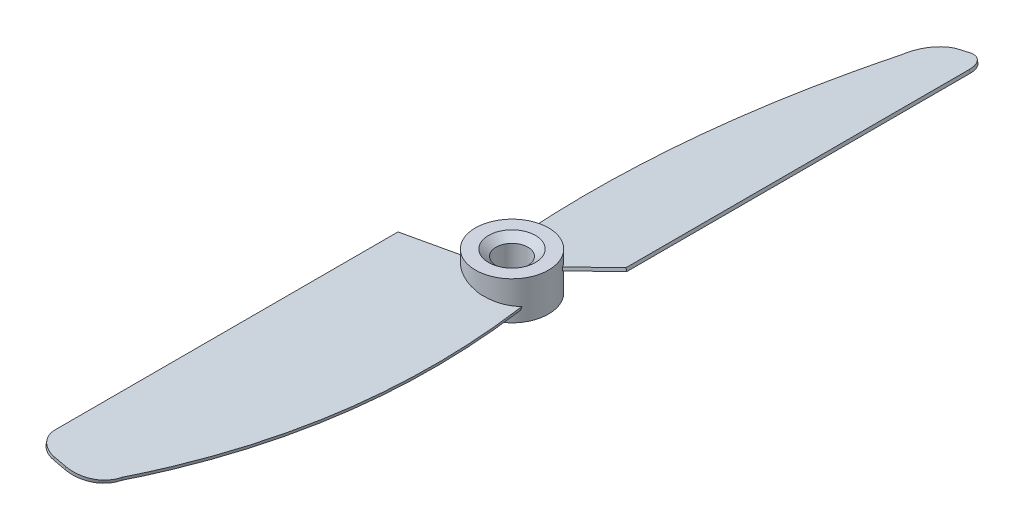
ISO-10303-21;
HEADER;
FILE_DESCRIPTION(('STEP AP214'),'2;1');
FILE_NAME('part.step','',(''),(''),'','','');
FILE_SCHEMA(('AUTOMOTIVE_DESIGN { 1 0 10303 214 1 1 1 1 }'));
ENDSEC;
DATA;
#1=APPLICATION_CONTEXT('core data for automotive mechanical design processes');
#2=APPLICATION_PROTOCOL_DEFINITION('international standard','automotive_design',2000,#1);
#3=PRODUCT_CONTEXT('',#1,'mechanical');
#4=PRODUCT('Part','Part','',(#3));
#5=PRODUCT_RELATED_PRODUCT_CATEGORY('part','',(#4));
#6=PRODUCT_DEFINITION_FORMATION('','',#4);
#7=PRODUCT_DEFINITION_CONTEXT('part definition',#1,'design');
#8=PRODUCT_DEFINITION('design','',#6,#7);
#9=PRODUCT_DEFINITION_SHAPE('','',#8);
#10=(LENGTH_UNIT() NAMED_UNIT(*) SI_UNIT(.MILLI.,.METRE.));
#11=(NAMED_UNIT(*) PLANE_ANGLE_UNIT() SI_UNIT($,.RADIAN.));
#12=(NAMED_UNIT(*) SI_UNIT($,.STERADIAN.) SOLID_ANGLE_UNIT());
#13=UNCERTAINTY_MEASURE_WITH_UNIT(LENGTH_MEASURE(1.E-05),#10,'distance_accuracy_value','');
#14=(GEOMETRIC_REPRESENTATION_CONTEXT(3) GLOBAL_UNCERTAINTY_ASSIGNED_CONTEXT((#13)) GLOBAL_UNIT_ASSIGNED_CONTEXT((#10,
#11,#12)) REPRESENTATION_CONTEXT('',''));
#15=CARTESIAN_POINT('',(0.,0.,0.));
#16=DIRECTION('',(0.,0.,1.));
#17=DIRECTION('',(1.,0.,0.));
#18=AXIS2_PLACEMENT_3D('',#15,#16,#17);
#19=CARTESIAN_POINT('',(0.,3.,0.));
#20=DIRECTION('',(0.,-1.,0.));
#21=DIRECTION('',(0.,0.,-1.));
#22=AXIS2_PLACEMENT_3D('',#19,#20,#21);
#23=CYLINDRICAL_SURFACE('',#22,5.75);
#24=CARTESIAN_POINT('',(-4.67726336570313,-1.3364073596061,-3.34450406007399));
#25=CARTESIAN_POINT('',(-4.69341324684552,-1.25444783516587,-3.32192850780571));
#26=CARTESIAN_POINT('',(-4.70950609013995,-1.17255648048604,-3.29907234110344));
#27=CARTESIAN_POINT('',(-4.7415777010329,-1.00891011064714,-3.25279877883091));
#28=CARTESIAN_POINT('',(-4.75755646863141,-0.927155095488071,-3.22938138326065));
#29=CARTESIAN_POINT('',(-4.77347819838196,-0.845468250089393,-3.20568337325641));
#30=B_SPLINE_CURVE_WITH_KNOTS('',3,(#24,#25,#26,#27,#28,#29),.UNSPECIFIED.,.F.,.F.,(4,2,4),(0.,
0.259592375458679,0.519184750917358),.UNSPECIFIED.);
#31=CARTESIAN_POINT('',(-4.67726336570313,-1.3364073596061,-3.34450406007399));
#32=VERTEX_POINT('',#31);
#33=CARTESIAN_POINT('',(-4.77347819838194,-0.845468250089405,-3.20568337325637));
#34=VERTEX_POINT('',#33);
#35=EDGE_CURVE('E55',#32,#34,#30,.T.);
#36=ORIENTED_EDGE('',*,*,#35,.F.);
#37=CARTESIAN_POINT('',(0.,-0.256576026948349,0.));
#38=DIRECTION('',(0.224951054343865,-0.974370064785235,0.));
#39=DIRECTION('',(-0.974370064785235,-0.224951054343865,0.));
#40=AXIS2_PLACEMENT_3D('',#37,#38,#39);
#41=ELLIPSE('',#40,5.901248619812,5.75);
#42=CARTESIAN_POINT('',(-1.04189928085542,-0.497117429254464,-5.65481616752951));
#43=VERTEX_POINT('',#42);
#44=EDGE_CURVE('E59',#32,#43,#41,.T.);
#45=ORIENTED_EDGE('',*,*,#44,.T.);
#46=CARTESIAN_POINT('',(-1.33975178959583,-0.0527300452728772,-5.59174079712881));
#47=CARTESIAN_POINT('',(-1.31438471711164,-0.089273146503689,-5.59781885388141));
#48=CARTESIAN_POINT('',(-1.28912875183752,-0.12592851454164,-5.60368727776329));
#49=CARTESIAN_POINT('',(-1.238879337404,-0.199473583211774,-5.61501028971525));
#50=CARTESIAN_POINT('',(-1.21388584722904,-0.236363245741532,-5.62046494329762));
#51=CARTESIAN_POINT('',(-1.16419352580197,-0.310398416991006,-5.63096778750059));
#52=CARTESIAN_POINT('',(-1.13949469557323,-0.347543926598596,-5.63601597670985));
#53=CARTESIAN_POINT('',(-1.09043283886063,-0.422116221937245,-5.64571364259828));
#54=CARTESIAN_POINT('',(-1.06606986628609,-0.459543051367535,-5.65036305588021));
#55=CARTESIAN_POINT('',(-1.04189928085561,-0.49711742925461,-5.65481616752946));
#56=B_SPLINE_CURVE_WITH_KNOTS('',3,(#46,#47,#48,#49,#50,#51,#52,#53,#54,#55),.UNSPECIFIED.,.F.,
.F.,(4,2,2,2,4),(0.,0.134693515699752,0.269365660657852,0.40403827320911,0.538732256427831),.UNSPECIFIED.);
#57=CARTESIAN_POINT('',(-1.33975178959582,-0.052730045272877,-5.59174079712881));
#58=VERTEX_POINT('',#57);
#59=EDGE_CURVE('E263',#58,#43,#56,.T.);
#60=ORIENTED_EDGE('',*,*,#59,.F.);
#61=CARTESIAN_POINT('',(0.,0.256576026948348,0.));
#62=DIRECTION('',(0.224951054343865,-0.974370064785235,0.));
#63=DIRECTION('',(-0.974370064785235,-0.224951054343865,0.));
#64=AXIS2_PLACEMENT_3D('',#61,#62,#63);
#65=ELLIPSE('',#64,5.901248619812,5.75);
#66=EDGE_CURVE('E269',#34,#58,#65,.T.);
#67=ORIENTED_EDGE('',*,*,#66,.F.);
#68=EDGE_LOOP('',(#36,#45,#60,#67));
#69=FACE_BOUND('',#68,.T.);
#70=CARTESIAN_POINT('',(0.124248058560635,-0.227891102417591,-5.74865744499913));
#71=CARTESIAN_POINT('',(0.113026019392753,-0.187747562934696,-5.74889971584825));
#72=CARTESIAN_POINT('',(0.102084198133285,-0.147526284309589,-5.74910360704102));
#73=CARTESIAN_POINT('',(0.0807089317288574,-0.0669540218012585,-5.74944354777249));
#74=CARTESIAN_POINT('',(0.0702754210385146,-0.0266030553600569,-5.74957960607908));
#75=CARTESIAN_POINT('',(0.0498619168644884,0.0542129039956292,-5.74979285593652));
#76=CARTESIAN_POINT('',(0.0398819200506539,0.0946778960705059,-5.74987004791969));
#77=CARTESIAN_POINT('',(0.0203272407159994,0.175711385136393,-5.7499723360793));
#78=CARTESIAN_POINT('',(0.0107526107729553,0.216279894834939,-5.74999742551797));
#79=CARTESIAN_POINT('',(0.00135788503709948,0.25688951941062,-5.74999983966506));
#80=B_SPLINE_CURVE_WITH_KNOTS('',3,(#70,#71,#72,#73,#74,#75,#76,#77,#78,#79),.UNSPECIFIED.,.F.,
.F.,(4,2,2,2,4),(0.,0.125047693776414,0.250079220053044,0.375109828075106,0.500156603715675),.UNSPECIFIED.);
#81=CARTESIAN_POINT('',(0.124248058560635,-0.227891102417591,-5.74865744499913));
#82=VERTEX_POINT('',#81);
#83=CARTESIAN_POINT('',(0.00135788503710264,0.25688951941062,-5.74999983966506));
#84=VERTEX_POINT('',#83);
#85=EDGE_CURVE('E255',#82,#84,#80,.T.);
#86=ORIENTED_EDGE('',*,*,#85,.F.);
#87=CARTESIAN_POINT('',(4.82105970998176,0.856453307603475,-3.13366929856847));
#88=VERTEX_POINT('',#87);
#89=EDGE_CURVE('E270',#82,#88,#41,.T.);
#90=ORIENTED_EDGE('',*,*,#89,.T.);
#91=CARTESIAN_POINT('',(0.,-6.44370658678145,0.));
#92=DIRECTION('',(-0.43176034970234,-0.09967973093552,-0.896463580780355));
#93=DIRECTION('',(0.043253174753564,-0.99501957329523,0.0898065233327475));
#94=AXIS2_PLACEMENT_3D('',#91,#92,#93);
#95=ELLIPSE('',#94,57.6847463976354,5.75);
#96=CARTESIAN_POINT('',(4.79296424736669,1.36311901286739,-3.17647504688211));
#97=VERTEX_POINT('',#96);
#98=EDGE_CURVE('E351',#97,#88,#95,.T.);
#99=ORIENTED_EDGE('',*,*,#98,.F.);
#100=EDGE_CURVE('E235',#84,#97,#65,.T.);
#101=ORIENTED_EDGE('',*,*,#100,.F.);
#102=EDGE_LOOP('',(#86,#90,#99,#101));
#103=FACE_BOUND('',#102,.T.);
#104=CARTESIAN_POINT('',(4.67726336570313,-1.3364073596061,3.34450406007399));
#105=CARTESIAN_POINT('',(4.69341324684552,-1.25444783516587,3.32192850780571));
#106=CARTESIAN_POINT('',(4.70950609013995,-1.17255648048604,3.29907234110344));
#107=CARTESIAN_POINT('',(4.7415777010329,-1.00891011064714,3.25279877883091));
#108=CARTESIAN_POINT('',(4.75755646863141,-0.927155095488071,3.22938138326065));
#109=CARTESIAN_POINT('',(4.77347819838196,-0.845468250089393,3.20568337325641));
#110=B_SPLINE_CURVE_WITH_KNOTS('',3,(#104,#105,#106,#107,#108,#109),.UNSPECIFIED.,.F.,.F.,(4,2,
4),(0.,0.259592375458679,0.519184750917358),.UNSPECIFIED.);
#111=CARTESIAN_POINT('',(4.67726336570313,-1.3364073596061,3.34450406007399));
#112=VERTEX_POINT('',#111);
#113=CARTESIAN_POINT('',(4.77347819838194,-0.845468250089405,3.20568337325637));
#114=VERTEX_POINT('',#113);
#115=EDGE_CURVE('E218',#112,#114,#110,.T.);
#116=ORIENTED_EDGE('',*,*,#115,.F.);
#117=CARTESIAN_POINT('',(0.,-0.256576026948349,0.));
#118=DIRECTION('',(-0.224951054343865,-0.974370064785235,0.));
#119=DIRECTION('',(0.974370064785235,-0.224951054343865,0.));
#120=AXIS2_PLACEMENT_3D('',#117,#118,#119);
#121=ELLIPSE('',#120,5.901248619812,5.75);
#122=CARTESIAN_POINT('',(1.04189928085542,-0.497117429254464,5.65481616752951));
#123=VERTEX_POINT('',#122);
#124=EDGE_CURVE('E227',#112,#123,#121,.T.);
#125=ORIENTED_EDGE('',*,*,#124,.T.);
#126=CARTESIAN_POINT('',(1.33975178959583,-0.0527300452728772,5.59174079712881));
#127=CARTESIAN_POINT('',(1.31438471711164,-0.089273146503689,5.59781885388141));
#128=CARTESIAN_POINT('',(1.28912875183752,-0.12592851454164,5.60368727776329));
#129=CARTESIAN_POINT('',(1.238879337404,-0.199473583211774,5.61501028971525));
#130=CARTESIAN_POINT('',(1.21388584722904,-0.236363245741532,5.62046494329762));
#131=CARTESIAN_POINT('',(1.16419352580197,-0.310398416991006,5.63096778750059));
#132=CARTESIAN_POINT('',(1.13949469557323,-0.347543926598596,5.63601597670985));
#133=CARTESIAN_POINT('',(1.09043283886063,-0.422116221937245,5.64571364259828));
#134=CARTESIAN_POINT('',(1.06606986628609,-0.459543051367535,5.65036305588021));
#135=CARTESIAN_POINT('',(1.04189928085561,-0.49711742925461,5.65481616752946));
#136=B_SPLINE_CURVE_WITH_KNOTS('',3,(#126,#127,#128,#129,#130,#131,#132,#133,#134,#135),
.UNSPECIFIED.,.F.,.F.,(4,2,2,2,4),(0.,0.134693515699752,0.269365660657852,0.40403827320911,
0.538732256427831),.UNSPECIFIED.);
#137=CARTESIAN_POINT('',(1.33975178959582,-0.052730045272877,5.59174079712881));
#138=VERTEX_POINT('',#137);
#139=EDGE_CURVE('E228',#138,#123,#136,.T.);
#140=ORIENTED_EDGE('',*,*,#139,.F.);
#141=CARTESIAN_POINT('',(0.,0.256576026948348,0.));
#142=DIRECTION('',(-0.224951054343865,-0.974370064785235,0.));
#143=DIRECTION('',(0.974370064785235,-0.224951054343865,0.));
#144=AXIS2_PLACEMENT_3D('',#141,#142,#143);
#145=ELLIPSE('',#144,5.901248619812,5.75);
#146=EDGE_CURVE('E438',#114,#138,#145,.T.);
#147=ORIENTED_EDGE('',*,*,#146,.F.);
#148=EDGE_LOOP('',(#116,#125,#140,#147));
#149=FACE_BOUND('',#148,.T.);
#150=CARTESIAN_POINT('',(-0.124248058560635,-0.227891102417591,5.74865744499913));
#151=CARTESIAN_POINT('',(-0.113026019392753,-0.187747562934696,5.74889971584825));
#152=CARTESIAN_POINT('',(-0.102084198133285,-0.147526284309589,5.74910360704102));
#153=CARTESIAN_POINT('',(-0.0807089317288574,-0.0669540218012585,5.74944354777249));
#154=CARTESIAN_POINT('',(-0.0702754210385146,-0.0266030553600569,5.74957960607908));
#155=CARTESIAN_POINT('',(-0.0498619168644884,0.0542129039956292,5.74979285593652));
#156=CARTESIAN_POINT('',(-0.0398819200506539,0.0946778960705059,5.74987004791969));
#157=CARTESIAN_POINT('',(-0.0203272407159994,0.175711385136393,5.7499723360793));
#158=CARTESIAN_POINT('',(-0.0107526107729553,0.216279894834939,5.74999742551797));
#159=CARTESIAN_POINT('',(-0.00135788503709948,0.25688951941062,5.74999983966506));
#160=B_SPLINE_CURVE_WITH_KNOTS('',3,(#150,#151,#152,#153,#154,#155,#156,#157,#158,#159),
.UNSPECIFIED.,.F.,.F.,(4,2,2,2,4),(0.,0.125047693776414,0.250079220053044,0.375109828075106,
0.500156603715675),.UNSPECIFIED.);
#161=CARTESIAN_POINT('',(-0.124248058560635,-0.227891102417591,5.74865744499913));
#162=VERTEX_POINT('',#161);
#163=CARTESIAN_POINT('',(-0.00135788503710264,0.25688951941062,5.74999983966506));
#164=VERTEX_POINT('',#163);
#165=EDGE_CURVE('E244',#162,#164,#160,.T.);
#166=ORIENTED_EDGE('',*,*,#165,.F.);
#167=CARTESIAN_POINT('',(-4.82105970998176,0.856453307603475,3.13366929856847));
#168=VERTEX_POINT('',#167);
#169=EDGE_CURVE('E444',#162,#168,#121,.T.);
#170=ORIENTED_EDGE('',*,*,#169,.T.);
#171=CARTESIAN_POINT('',(0.,-6.44370658678145,0.));
#172=DIRECTION('',(0.43176034970234,-0.09967973093552,0.896463580780355));
#173=DIRECTION('',(-0.043253174753564,-0.99501957329523,-0.0898065233327475));
#174=AXIS2_PLACEMENT_3D('',#171,#172,#173);
#175=ELLIPSE('',#174,57.6847463976354,5.75);
#176=CARTESIAN_POINT('',(-4.79296424736669,1.36311901286739,3.17647504688211));
#177=VERTEX_POINT('',#176);
#178=EDGE_CURVE('E442',#177,#168,#175,.T.);
#179=ORIENTED_EDGE('',*,*,#178,.F.);
#180=EDGE_CURVE('E435',#164,#177,#145,.T.);
#181=ORIENTED_EDGE('',*,*,#180,.F.);
#182=EDGE_LOOP('',(#166,#170,#179,#181));
#183=FACE_BOUND('',#182,.T.);
#184=CARTESIAN_POINT('',(0.,3.,0.));
#185=DIRECTION('',(0.,1.,0.));
#186=DIRECTION('',(0.,0.,1.));
#187=AXIS2_PLACEMENT_3D('',#184,#185,#186);
#188=CIRCLE('',#187,5.75);
#189=CARTESIAN_POINT('',(0.,3.,5.75));
#190=VERTEX_POINT('',#189);
#191=EDGE_CURVE('E432',#190,#190,#188,.T.);
#192=ORIENTED_EDGE('',*,*,#191,.F.);
#193=EDGE_LOOP('',(#192));
#194=FACE_BOUND('',#193,.T.);
#195=CARTESIAN_POINT('',(0.,-3.,0.));
#196=DIRECTION('',(0.,1.,0.));
#197=DIRECTION('',(0.,0.,1.));
#198=AXIS2_PLACEMENT_3D('',#195,#196,#197);
#199=CIRCLE('',#198,5.75);
#200=CARTESIAN_POINT('',(0.,-3.,5.75));
#201=VERTEX_POINT('',#200);
#202=EDGE_CURVE('E431',#201,#201,#199,.T.);
#203=ORIENTED_EDGE('',*,*,#202,.T.);
#204=EDGE_LOOP('',(#203));
#205=FACE_BOUND('',#204,.T.);
#206=ADVANCED_FACE('F39',(#69,#103,#149,#183,#194,#205),#23,.T.);
#207=CARTESIAN_POINT('',(0.,3.,0.));
#208=DIRECTION('',(0.,1.,0.));
#209=DIRECTION('',(0.,0.,1.));
#210=AXIS2_PLACEMENT_3D('',#207,#208,#209);
#211=PLANE('',#210);
#212=CARTESIAN_POINT('',(0.,3.,0.));
#213=DIRECTION('',(0.,1.,0.));
#214=DIRECTION('',(0.,0.,1.));
#215=AXIS2_PLACEMENT_3D('',#212,#213,#214);
#216=CIRCLE('',#215,3.69175359259423);
#217=CARTESIAN_POINT('',(0.,3.,3.69175359259423));
#218=VERTEX_POINT('',#217);
#219=EDGE_CURVE('E11',#218,#218,#216,.F.);
#220=ORIENTED_EDGE('',*,*,#219,.T.);
#221=EDGE_LOOP('',(#220));
#222=FACE_BOUND('',#221,.T.);
#223=ORIENTED_EDGE('',*,*,#191,.T.);
#224=EDGE_LOOP('',(#223));
#225=FACE_BOUND('',#224,.T.);
#226=ADVANCED_FACE('F215',(#222,#225),#211,.T.);
#227=CARTESIAN_POINT('',(0.,-3.,0.));
#228=DIRECTION('',(0.,1.,0.));
#229=DIRECTION('',(0.,0.,1.));
#230=AXIS2_PLACEMENT_3D('',#227,#228,#229);
#231=PLANE('',#230);
#232=CARTESIAN_POINT('',(0.,-3.,0.));
#233=DIRECTION('',(0.,1.,0.));
#234=DIRECTION('',(0.,0.,1.));
#235=AXIS2_PLACEMENT_3D('',#232,#233,#234);
#236=CIRCLE('',#235,3.50000000000002);
#237=CARTESIAN_POINT('',(0.,-3.,3.50000000000002));
#238=VERTEX_POINT('',#237);
#239=EDGE_CURVE('E48',#238,#238,#236,.T.);
#240=ORIENTED_EDGE('',*,*,#239,.T.);
#241=EDGE_LOOP('',(#240));
#242=FACE_BOUND('',#241,.T.);
#243=ORIENTED_EDGE('',*,*,#202,.F.);
#244=EDGE_LOOP('',(#243));
#245=FACE_BOUND('',#244,.T.);
#246=ADVANCED_FACE('F211',(#242,#245),#231,.F.);
#247=CARTESIAN_POINT('',(4.48280838972129,-1.2915138910458,1.76136176981266));
#248=CARTESIAN_POINT('',(8.32155851375444,-2.17775918836437,31.5051869267904));
#249=CARTESIAN_POINT('',(-1.98314357657321,0.20126874331739,59.4193792282431));
#250=B_SPLINE_CURVE_WITH_KNOTS('',2,(#247,#248,#249),.UNSPECIFIED.,.F.,.F.,(3,3),(0.,1.),.UNSPECIFIED.);
#251=DIRECTION('',(0.224951054343865,0.974370064785235,0.));
#252=VECTOR('',#251,1.);
#253=SURFACE_OF_LINEAR_EXTRUSION('',#250,#252);
#254=CARTESIAN_POINT('',(-1.98314357657321,0.20126874331739,59.4193792282431));
#255=VERTEX_POINT('',#254);
#256=EDGE_CURVE('E193',#112,#255,#250,.T.);
#257=ORIENTED_EDGE('',*,*,#256,.F.);
#258=ORIENTED_EDGE('',*,*,#115,.T.);
#259=CARTESIAN_POINT('',(4.59528391689322,-0.804328858653185,1.76136176981266));
#260=CARTESIAN_POINT('',(8.43403404092637,-1.69057415597175,31.5051869267904));
#261=CARTESIAN_POINT('',(-1.87066804940128,0.688453775710007,59.4193792282431));
#262=B_SPLINE_CURVE_WITH_KNOTS('',2,(#259,#260,#261),.UNSPECIFIED.,.F.,.F.,(3,3),(0.,1.),.UNSPECIFIED.);
#263=CARTESIAN_POINT('',(-1.87066804940128,0.688453775710007,59.4193792282431));
#264=VERTEX_POINT('',#263);
#265=EDGE_CURVE('E185',#114,#264,#262,.T.);
#266=ORIENTED_EDGE('',*,*,#265,.T.);
#267=DIRECTION('',(0.224951054343865,0.974370064785235,0.));
#268=VECTOR('',#267,1.);
#269=CARTESIAN_POINT('',(-1.98314357657321,0.20126874331739,59.4193792282431));
#270=LINE('',#269,#268);
#271=EDGE_CURVE('E428',#255,#264,#270,.T.);
#272=ORIENTED_EDGE('',*,*,#271,.F.);
#273=EDGE_LOOP('',(#257,#258,#266,#272));
#274=FACE_BOUND('',#273,.T.);
#275=ADVANCED_FACE('F205',(#274),#253,.F.);
#276=CARTESIAN_POINT('',(-4.1660186125634,0.705225154329594,2.8013689560831));
#277=CARTESIAN_POINT('',(0.986868008005342,-0.484412458836229,9.22584427933046));
#278=CARTESIAN_POINT('',(4.48280838972129,-1.2915138910458,1.76136176981266));
#279=B_SPLINE_CURVE_WITH_KNOTS('',2,(#276,#277,#278),.UNSPECIFIED.,.F.,.F.,(3,3),(0.,1.),.UNSPECIFIED.);
#280=DIRECTION('',(0.224951054343865,0.974370064785235,0.));
#281=VECTOR('',#280,1.);
#282=SURFACE_OF_LINEAR_EXTRUSION('',#279,#281);
#283=EDGE_CURVE('E382',#162,#123,#279,.T.);
#284=ORIENTED_EDGE('',*,*,#283,.F.);
#285=ORIENTED_EDGE('',*,*,#165,.T.);
#286=CARTESIAN_POINT('',(-4.05354308539146,1.19241018672221,2.8013689560831));
#287=CARTESIAN_POINT('',(1.09934353517727,0.00277257355638821,9.22584427933046));
#288=CARTESIAN_POINT('',(4.59528391689322,-0.804328858653185,1.76136176981266));
#289=B_SPLINE_CURVE_WITH_KNOTS('',2,(#286,#287,#288),.UNSPECIFIED.,.F.,.F.,(3,3),(0.,1.),.UNSPECIFIED.);
#290=EDGE_CURVE('E199',#164,#138,#289,.T.);
#291=ORIENTED_EDGE('',*,*,#290,.T.);
#292=ORIENTED_EDGE('',*,*,#139,.T.);
#293=EDGE_LOOP('',(#284,#285,#291,#292));
#294=FACE_BOUND('',#293,.T.);
#295=ADVANCED_FACE('F210',(#294),#282,.F.);
#296=CARTESIAN_POINT('',(-6.77192630215048,1.30684634886476,58.5));
#297=DIRECTION('',(0.224951054343865,0.974370064785235,0.));
#298=DIRECTION('',(-0.974370064785235,0.224951054343865,0.));
#299=AXIS2_PLACEMENT_3D('',#296,#297,#298);
#300=CYLINDRICAL_SURFACE('',#299,5.);
#301=CARTESIAN_POINT('',(-6.65945077497855,1.79403138125738,58.5));
#302=DIRECTION('',(-0.224951054343865,-0.974370064785235,0.));
#303=DIRECTION('',(0.974370064785235,-0.224951054343865,0.));
#304=AXIS2_PLACEMENT_3D('',#301,#302,#303);
#305=CIRCLE('',#304,5.);
#306=CARTESIAN_POINT('',(-6.65945077497855,1.79403138125738,63.5));
#307=VERTEX_POINT('',#306);
#308=EDGE_CURVE('E187',#264,#307,#305,.T.);
#309=ORIENTED_EDGE('',*,*,#308,.T.);
#310=DIRECTION('',(0.224951054343865,0.974370064785235,0.));
#311=VECTOR('',#310,1.);
#312=CARTESIAN_POINT('',(-6.77192630215048,1.30684634886476,63.5));
#313=LINE('',#312,#311);
#314=CARTESIAN_POINT('',(-6.77192630215048,1.30684634886476,63.5));
#315=VERTEX_POINT('',#314);
#316=EDGE_CURVE('E425',#315,#307,#313,.T.);
#317=ORIENTED_EDGE('',*,*,#316,.F.);
#318=CARTESIAN_POINT('',(-6.77192630215048,1.30684634886476,58.5));
#319=DIRECTION('',(-0.224951054343865,-0.974370064785235,0.));
#320=DIRECTION('',(0.974370064785235,-0.224951054343865,0.));
#321=AXIS2_PLACEMENT_3D('',#318,#319,#320);
#322=CIRCLE('',#321,5.);
#323=EDGE_CURVE('E198',#255,#315,#322,.T.);
#324=ORIENTED_EDGE('',*,*,#323,.F.);
#325=ORIENTED_EDGE('',*,*,#271,.T.);
#326=EDGE_LOOP('',(#309,#317,#324,#325));
#327=FACE_BOUND('',#326,.T.);
#328=ADVANCED_FACE('F213',(#327),#300,.T.);
#329=CARTESIAN_POINT('',(-8.58879080938535,1.72630257117031,63.5));
#330=DIRECTION('',(0.,0.,-1.));
#331=DIRECTION('',(-1.,0.,0.));
#332=AXIS2_PLACEMENT_3D('',#329,#330,#331);
#333=PLANE('',#332);
#334=DIRECTION('',(-0.974370064785235,0.224951054343865,0.));
#335=VECTOR('',#334,1.);
#336=CARTESIAN_POINT('',(-8.47631528221342,2.21348760356293,63.5));
#337=LINE('',#336,#335);
#338=CARTESIAN_POINT('',(-8.47631528221342,2.21348760356293,63.5));
#339=VERTEX_POINT('',#338);
#340=EDGE_CURVE('E401',#307,#339,#337,.T.);
#341=ORIENTED_EDGE('',*,*,#340,.T.);
#342=DIRECTION('',(0.224951054343865,0.974370064785235,0.));
#343=VECTOR('',#342,1.);
#344=CARTESIAN_POINT('',(-8.58879080938535,1.72630257117031,63.5));
#345=LINE('',#344,#343);
#346=CARTESIAN_POINT('',(-8.58879080938535,1.72630257117031,63.5));
#347=VERTEX_POINT('',#346);
#348=EDGE_CURVE('E422',#347,#339,#345,.T.);
#349=ORIENTED_EDGE('',*,*,#348,.F.);
#350=DIRECTION('',(-0.974370064785235,0.224951054343865,0.));
#351=VECTOR('',#350,1.);
#352=CARTESIAN_POINT('',(-8.58879080938535,1.72630257117031,63.5));
#353=LINE('',#352,#351);
#354=EDGE_CURVE('E715',#315,#347,#353,.T.);
#355=ORIENTED_EDGE('',*,*,#354,.F.);
#356=ORIENTED_EDGE('',*,*,#316,.T.);
#357=EDGE_LOOP('',(#341,#349,#355,#356));
#358=FACE_BOUND('',#357,.T.);
#359=ADVANCED_FACE('F524',(#358),#333,.F.);
#360=CARTESIAN_POINT('',(-8.58879080938537,1.72630257117032,60.5));
#361=DIRECTION('',(0.224951054343865,0.974370064785235,0.));
#362=DIRECTION('',(-0.974370064785235,0.224951054343865,0.));
#363=AXIS2_PLACEMENT_3D('',#360,#361,#362);
#364=CYLINDRICAL_SURFACE('',#363,3.);
#365=CARTESIAN_POINT('',(-8.47631528221344,2.21348760356294,60.5));
#366=DIRECTION('',(-0.224951054343865,-0.974370064785235,0.));
#367=DIRECTION('',(-0.974370064785235,0.224951054343865,0.));
#368=AXIS2_PLACEMENT_3D('',#365,#366,#367);
#369=CIRCLE('',#368,3.);
#370=CARTESIAN_POINT('',(-11.3994254765691,2.88834076659453,60.5));
#371=VERTEX_POINT('',#370);
#372=EDGE_CURVE('E403',#339,#371,#369,.T.);
#373=ORIENTED_EDGE('',*,*,#372,.T.);
#374=DIRECTION('',(0.224951054343865,0.974370064785235,0.));
#375=VECTOR('',#374,1.);
#376=CARTESIAN_POINT('',(-11.5119010037411,2.40115573420191,60.5));
#377=LINE('',#376,#375);
#378=CARTESIAN_POINT('',(-11.5119010037411,2.40115573420191,60.5));
#379=VERTEX_POINT('',#378);
#380=EDGE_CURVE('E419',#379,#371,#377,.T.);
#381=ORIENTED_EDGE('',*,*,#380,.F.);
#382=CARTESIAN_POINT('',(-8.58879080938537,1.72630257117032,60.5));
#383=DIRECTION('',(-0.224951054343865,-0.974370064785235,0.));
#384=DIRECTION('',(-0.974370064785235,0.224951054343865,0.));
#385=AXIS2_PLACEMENT_3D('',#382,#383,#384);
#386=CIRCLE('',#385,3.);
#387=EDGE_CURVE('E712',#347,#379,#386,.T.);
#388=ORIENTED_EDGE('',*,*,#387,.F.);
#389=ORIENTED_EDGE('',*,*,#348,.T.);
#390=EDGE_LOOP('',(#373,#381,#388,#389));
#391=FACE_BOUND('',#390,.T.);
#392=ADVANCED_FACE('F531',(#391),#364,.T.);
#393=CARTESIAN_POINT('',(-11.5119010037411,2.40115573420191,6.52791259443827));
#394=DIRECTION('',(0.974370064785235,-0.224951054343865,0.));
#395=DIRECTION('',(0.224951054343865,0.974370064785235,0.));
#396=AXIS2_PLACEMENT_3D('',#393,#394,#395);
#397=PLANE('',#396);
#398=DIRECTION('',(0.,0.,-1.));
#399=VECTOR('',#398,1.);
#400=CARTESIAN_POINT('',(-11.3994254765691,2.88834076659453,6.52791259443827));
#401=LINE('',#400,#399);
#402=CARTESIAN_POINT('',(-11.3994254765691,2.88834076659453,6.52791259443827));
#403=VERTEX_POINT('',#402);
#404=EDGE_CURVE('E405',#371,#403,#401,.T.);
#405=ORIENTED_EDGE('',*,*,#404,.T.);
#406=DIRECTION('',(0.224951054343865,0.974370064785235,0.));
#407=VECTOR('',#406,1.);
#408=CARTESIAN_POINT('',(-11.5119010037411,2.40115573420191,6.52791259443827));
#409=LINE('',#408,#407);
#410=CARTESIAN_POINT('',(-11.5119010037411,2.40115573420191,6.52791259443827));
#411=VERTEX_POINT('',#410);
#412=EDGE_CURVE('E388',#411,#403,#409,.T.);
#413=ORIENTED_EDGE('',*,*,#412,.F.);
#414=DIRECTION('',(0.,0.,-1.));
#415=VECTOR('',#414,1.);
#416=CARTESIAN_POINT('',(-11.5119010037411,2.40115573420191,6.52791259443827));
#417=LINE('',#416,#415);
#418=EDGE_CURVE('E710',#379,#411,#417,.T.);
#419=ORIENTED_EDGE('',*,*,#418,.F.);
#420=ORIENTED_EDGE('',*,*,#380,.T.);
#421=EDGE_LOOP('',(#405,#413,#419,#420));
#422=FACE_BOUND('',#421,.T.);
#423=ADVANCED_FACE('F538',(#422),#397,.F.);
#424=CARTESIAN_POINT('',(-4.1660186125634,0.705225154329594,2.8013689560831));
#425=DIRECTION('',(0.43176034970234,-0.09967973093552,0.896463580780355));
#426=DIRECTION('',(0.900950699704846,0.,-0.433921463748164));
#427=AXIS2_PLACEMENT_3D('',#424,#425,#426);
#428=PLANE('',#427);
#429=DIRECTION('',(0.873487277282558,-0.201660427677418,-0.443117420481823));
#430=VECTOR('',#429,1.);
#431=CARTESIAN_POINT('',(-4.05354308539146,1.19241018672221,2.8013689560831));
#432=LINE('',#431,#430);
#433=EDGE_CURVE('E407',#403,#177,#432,.T.);
#434=ORIENTED_EDGE('',*,*,#433,.T.);
#435=ORIENTED_EDGE('',*,*,#178,.T.);
#436=DIRECTION('',(0.873487277282558,-0.201660427677418,-0.443117420481823));
#437=VECTOR('',#436,1.);
#438=CARTESIAN_POINT('',(-4.1660186125634,0.705225154329594,2.8013689560831));
#439=LINE('',#438,#437);
#440=EDGE_CURVE('E389',#411,#168,#439,.T.);
#441=ORIENTED_EDGE('',*,*,#440,.F.);
#442=ORIENTED_EDGE('',*,*,#412,.T.);
#443=EDGE_LOOP('',(#434,#435,#441,#442));
#444=FACE_BOUND('',#443,.T.);
#445=ADVANCED_FACE('F371',(#444),#428,.F.);
#446=CARTESIAN_POINT('',(4.78569546016424,-1.36144088111429,31.0477787129091));
#447=DIRECTION('',(-0.224951054343865,-0.974370064785235,0.));
#448=DIRECTION('',(0.974370064785235,-0.224951054343865,0.));
#449=AXIS2_PLACEMENT_3D('',#446,#447,#448);
#450=PLANE('',#449);
#451=ORIENTED_EDGE('',*,*,#124,.F.);
#452=ORIENTED_EDGE('',*,*,#256,.T.);
#453=ORIENTED_EDGE('',*,*,#323,.T.);
#454=ORIENTED_EDGE('',*,*,#354,.T.);
#455=ORIENTED_EDGE('',*,*,#387,.T.);
#456=ORIENTED_EDGE('',*,*,#418,.T.);
#457=ORIENTED_EDGE('',*,*,#440,.T.);
#458=ORIENTED_EDGE('',*,*,#169,.F.);
#459=ORIENTED_EDGE('',*,*,#283,.T.);
#460=EDGE_LOOP('',(#451,#452,#453,#454,#455,#456,#457,#458,#459));
#461=FACE_BOUND('',#460,.T.);
#462=ADVANCED_FACE('F368',(#461),#450,.T.);
#463=CARTESIAN_POINT('',(4.89817098733617,-0.87425584872167,31.0477787129091));
#464=DIRECTION('',(-0.224951054343865,-0.974370064785235,0.));
#465=DIRECTION('',(0.974370064785235,-0.224951054343865,0.));
#466=AXIS2_PLACEMENT_3D('',#463,#464,#465);
#467=PLANE('',#466);
#468=ORIENTED_EDGE('',*,*,#265,.F.);
#469=ORIENTED_EDGE('',*,*,#146,.T.);
#470=ORIENTED_EDGE('',*,*,#290,.F.);
#471=ORIENTED_EDGE('',*,*,#180,.T.);
#472=ORIENTED_EDGE('',*,*,#433,.F.);
#473=ORIENTED_EDGE('',*,*,#404,.F.);
#474=ORIENTED_EDGE('',*,*,#372,.F.);
#475=ORIENTED_EDGE('',*,*,#340,.F.);
#476=ORIENTED_EDGE('',*,*,#308,.F.);
#477=EDGE_LOOP('',(#468,#469,#470,#471,#472,#473,#474,#475,#476));
#478=FACE_BOUND('',#477,.T.);
#479=ADVANCED_FACE('F366',(#478),#467,.F.);
#480=CARTESIAN_POINT('',(-4.48280838972129,-1.2915138910458,-1.76136176981266));
#481=CARTESIAN_POINT('',(-8.32155851375444,-2.17775918836437,-31.5051869267904));
#482=CARTESIAN_POINT('',(1.98314357657321,0.20126874331739,-59.4193792282431));
#483=B_SPLINE_CURVE_WITH_KNOTS('',2,(#480,#481,#482),.UNSPECIFIED.,.F.,.F.,(3,3),(0.,1.),.UNSPECIFIED.);
#484=DIRECTION('',(-0.224951054343865,0.974370064785235,0.));
#485=VECTOR('',#484,1.);
#486=SURFACE_OF_LINEAR_EXTRUSION('',#483,#485);
#487=CARTESIAN_POINT('',(1.98314357657321,0.20126874331739,-59.4193792282431));
#488=VERTEX_POINT('',#487);
#489=EDGE_CURVE('E162',#32,#488,#483,.T.);
#490=ORIENTED_EDGE('',*,*,#489,.F.);
#491=ORIENTED_EDGE('',*,*,#35,.T.);
#492=CARTESIAN_POINT('',(-4.59528391689322,-0.804328858653185,-1.76136176981266));
#493=CARTESIAN_POINT('',(-8.43403404092637,-1.69057415597175,-31.5051869267904));
#494=CARTESIAN_POINT('',(1.87066804940128,0.688453775710007,-59.4193792282431));
#495=B_SPLINE_CURVE_WITH_KNOTS('',2,(#492,#493,#494),.UNSPECIFIED.,.F.,.F.,(3,3),(0.,1.),.UNSPECIFIED.);
#496=CARTESIAN_POINT('',(1.87066804940128,0.688453775710007,-59.4193792282431));
#497=VERTEX_POINT('',#496);
#498=EDGE_CURVE('E183',#34,#497,#495,.T.);
#499=ORIENTED_EDGE('',*,*,#498,.T.);
#500=DIRECTION('',(-0.224951054343865,0.974370064785235,0.));
#501=VECTOR('',#500,1.);
#502=CARTESIAN_POINT('',(1.98314357657321,0.20126874331739,-59.4193792282431));
#503=LINE('',#502,#501);
#504=EDGE_CURVE('E175',#488,#497,#503,.T.);
#505=ORIENTED_EDGE('',*,*,#504,.F.);
#506=EDGE_LOOP('',(#490,#491,#499,#505));
#507=FACE_BOUND('',#506,.T.);
#508=ADVANCED_FACE('F181',(#507),#486,.F.);
#509=CARTESIAN_POINT('',(4.1660186125634,0.705225154329594,-2.8013689560831));
#510=CARTESIAN_POINT('',(-0.986868008005342,-0.484412458836229,-9.22584427933046));
#511=CARTESIAN_POINT('',(-4.48280838972129,-1.2915138910458,-1.76136176981266));
#512=B_SPLINE_CURVE_WITH_KNOTS('',2,(#509,#510,#511),.UNSPECIFIED.,.F.,.F.,(3,3),(0.,1.),.UNSPECIFIED.);
#513=DIRECTION('',(-0.224951054343865,0.974370064785235,0.));
#514=VECTOR('',#513,1.);
#515=SURFACE_OF_LINEAR_EXTRUSION('',#512,#514);
#516=EDGE_CURVE('E289',#82,#43,#512,.T.);
#517=ORIENTED_EDGE('',*,*,#516,.F.);
#518=ORIENTED_EDGE('',*,*,#85,.T.);
#519=CARTESIAN_POINT('',(4.05354308539146,1.19241018672221,-2.8013689560831));
#520=CARTESIAN_POINT('',(-1.09934353517727,0.00277257355638821,-9.22584427933046));
#521=CARTESIAN_POINT('',(-4.59528391689322,-0.804328858653185,-1.76136176981266));
#522=B_SPLINE_CURVE_WITH_KNOTS('',2,(#519,#520,#521),.UNSPECIFIED.,.F.,.F.,(3,3),(0.,1.),.UNSPECIFIED.);
#523=EDGE_CURVE('E170',#84,#58,#522,.T.);
#524=ORIENTED_EDGE('',*,*,#523,.T.);
#525=ORIENTED_EDGE('',*,*,#59,.T.);
#526=EDGE_LOOP('',(#517,#518,#524,#525));
#527=FACE_BOUND('',#526,.T.);
#528=ADVANCED_FACE('F277',(#527),#515,.F.);
#529=CARTESIAN_POINT('',(6.77192630215048,1.30684634886476,-58.5));
#530=DIRECTION('',(-0.224951054343865,0.974370064785235,0.));
#531=DIRECTION('',(-0.974370064785235,-0.224951054343865,0.));
#532=AXIS2_PLACEMENT_3D('',#529,#530,#531);
#533=CYLINDRICAL_SURFACE('',#532,5.);
#534=CARTESIAN_POINT('',(6.65945077497855,1.79403138125738,-58.5));
#535=DIRECTION('',(0.224951054343865,-0.974370064785235,0.));
#536=DIRECTION('',(-0.974370064785235,-0.224951054343865,0.));
#537=AXIS2_PLACEMENT_3D('',#534,#535,#536);
#538=CIRCLE('',#537,5.);
#539=CARTESIAN_POINT('',(6.65945077497855,1.79403138125738,-63.5));
#540=VERTEX_POINT('',#539);
#541=EDGE_CURVE('E304',#497,#540,#538,.T.);
#542=ORIENTED_EDGE('',*,*,#541,.T.);
#543=DIRECTION('',(-0.224951054343865,0.974370064785235,0.));
#544=VECTOR('',#543,1.);
#545=CARTESIAN_POINT('',(6.77192630215048,1.30684634886476,-63.5));
#546=LINE('',#545,#544);
#547=CARTESIAN_POINT('',(6.77192630215048,1.30684634886476,-63.5));
#548=VERTEX_POINT('',#547);
#549=EDGE_CURVE('E177',#548,#540,#546,.T.);
#550=ORIENTED_EDGE('',*,*,#549,.F.);
#551=CARTESIAN_POINT('',(6.77192630215048,1.30684634886476,-58.5));
#552=DIRECTION('',(0.224951054343865,-0.974370064785235,0.));
#553=DIRECTION('',(-0.974370064785235,-0.224951054343865,0.));
#554=AXIS2_PLACEMENT_3D('',#551,#552,#553);
#555=CIRCLE('',#554,5.);
#556=EDGE_CURVE('E165',#488,#548,#555,.T.);
#557=ORIENTED_EDGE('',*,*,#556,.F.);
#558=ORIENTED_EDGE('',*,*,#504,.T.);
#559=EDGE_LOOP('',(#542,#550,#557,#558));
#560=FACE_BOUND('',#559,.T.);
#561=ADVANCED_FACE('F174',(#560),#533,.T.);
#562=CARTESIAN_POINT('',(8.58879080938535,1.72630257117031,-63.5));
#563=DIRECTION('',(0.,0.,1.));
#564=DIRECTION('',(1.,0.,0.));
#565=AXIS2_PLACEMENT_3D('',#562,#563,#564);
#566=PLANE('',#565);
#567=DIRECTION('',(0.974370064785235,0.224951054343865,0.));
#568=VECTOR('',#567,1.);
#569=CARTESIAN_POINT('',(8.47631528221342,2.21348760356293,-63.5));
#570=LINE('',#569,#568);
#571=CARTESIAN_POINT('',(8.47631528221342,2.21348760356293,-63.5));
#572=VERTEX_POINT('',#571);
#573=EDGE_CURVE('E309',#540,#572,#570,.T.);
#574=ORIENTED_EDGE('',*,*,#573,.T.);
#575=DIRECTION('',(-0.224951054343865,0.974370064785235,0.));
#576=VECTOR('',#575,1.);
#577=CARTESIAN_POINT('',(8.58879080938535,1.72630257117031,-63.5));
#578=LINE('',#577,#576);
#579=CARTESIAN_POINT('',(8.58879080938535,1.72630257117031,-63.5));
#580=VERTEX_POINT('',#579);
#581=EDGE_CURVE('E189',#580,#572,#578,.T.);
#582=ORIENTED_EDGE('',*,*,#581,.F.);
#583=DIRECTION('',(0.974370064785235,0.224951054343865,0.));
#584=VECTOR('',#583,1.);
#585=CARTESIAN_POINT('',(8.58879080938535,1.72630257117031,-63.5));
#586=LINE('',#585,#584);
#587=EDGE_CURVE('E179',#548,#580,#586,.T.);
#588=ORIENTED_EDGE('',*,*,#587,.F.);
#589=ORIENTED_EDGE('',*,*,#549,.T.);
#590=EDGE_LOOP('',(#574,#582,#588,#589));
#591=FACE_BOUND('',#590,.T.);
#592=ADVANCED_FACE('F459',(#591),#566,.F.);
#593=CARTESIAN_POINT('',(8.58879080938537,1.72630257117032,-60.5));
#594=DIRECTION('',(-0.224951054343865,0.974370064785235,0.));
#595=DIRECTION('',(-0.974370064785235,-0.224951054343865,0.));
#596=AXIS2_PLACEMENT_3D('',#593,#594,#595);
#597=CYLINDRICAL_SURFACE('',#596,3.);
#598=CARTESIAN_POINT('',(8.47631528221344,2.21348760356294,-60.5));
#599=DIRECTION('',(0.224951054343865,-0.974370064785235,0.));
#600=DIRECTION('',(0.974370064785235,0.224951054343865,0.));
#601=AXIS2_PLACEMENT_3D('',#598,#599,#600);
#602=CIRCLE('',#601,3.);
#603=CARTESIAN_POINT('',(11.3994254765691,2.88834076659453,-60.5));
#604=VERTEX_POINT('',#603);
#605=EDGE_CURVE('E311',#572,#604,#602,.T.);
#606=ORIENTED_EDGE('',*,*,#605,.T.);
#607=DIRECTION('',(-0.224951054343865,0.974370064785235,0.));
#608=VECTOR('',#607,1.);
#609=CARTESIAN_POINT('',(11.5119010037411,2.40115573420191,-60.5));
#610=LINE('',#609,#608);
#611=CARTESIAN_POINT('',(11.5119010037411,2.40115573420191,-60.5));
#612=VERTEX_POINT('',#611);
#613=EDGE_CURVE('E327',#612,#604,#610,.T.);
#614=ORIENTED_EDGE('',*,*,#613,.F.);
#615=CARTESIAN_POINT('',(8.58879080938537,1.72630257117032,-60.5));
#616=DIRECTION('',(0.224951054343865,-0.974370064785235,0.));
#617=DIRECTION('',(0.974370064785235,0.224951054343865,0.));
#618=AXIS2_PLACEMENT_3D('',#615,#616,#617);
#619=CIRCLE('',#618,3.);
#620=EDGE_CURVE('E336',#580,#612,#619,.T.);
#621=ORIENTED_EDGE('',*,*,#620,.F.);
#622=ORIENTED_EDGE('',*,*,#581,.T.);
#623=EDGE_LOOP('',(#606,#614,#621,#622));
#624=FACE_BOUND('',#623,.T.);
#625=ADVANCED_FACE('F334',(#624),#597,.T.);
#626=CARTESIAN_POINT('',(11.5119010037411,2.40115573420191,-6.52791259443827));
#627=DIRECTION('',(-0.974370064785235,-0.224951054343865,0.));
#628=DIRECTION('',(0.224951054343865,-0.974370064785235,0.));
#629=AXIS2_PLACEMENT_3D('',#626,#627,#628);
#630=PLANE('',#629);
#631=DIRECTION('',(0.,0.,1.));
#632=VECTOR('',#631,1.);
#633=CARTESIAN_POINT('',(11.3994254765691,2.88834076659453,-6.52791259443827));
#634=LINE('',#633,#632);
#635=CARTESIAN_POINT('',(11.3994254765691,2.88834076659453,-6.52791259443827));
#636=VERTEX_POINT('',#635);
#637=EDGE_CURVE('E313',#604,#636,#634,.T.);
#638=ORIENTED_EDGE('',*,*,#637,.T.);
#639=DIRECTION('',(-0.224951054343865,0.974370064785235,0.));
#640=VECTOR('',#639,1.);
#641=CARTESIAN_POINT('',(11.5119010037411,2.40115573420191,-6.52791259443827));
#642=LINE('',#641,#640);
#643=CARTESIAN_POINT('',(11.5119010037411,2.40115573420191,-6.52791259443827));
#644=VERTEX_POINT('',#643);
#645=EDGE_CURVE('E295',#644,#636,#642,.T.);
#646=ORIENTED_EDGE('',*,*,#645,.F.);
#647=DIRECTION('',(0.,0.,1.));
#648=VECTOR('',#647,1.);
#649=CARTESIAN_POINT('',(11.5119010037411,2.40115573420191,-6.52791259443827));
#650=LINE('',#649,#648);
#651=EDGE_CURVE('E353',#612,#644,#650,.T.);
#652=ORIENTED_EDGE('',*,*,#651,.F.);
#653=ORIENTED_EDGE('',*,*,#613,.T.);
#654=EDGE_LOOP('',(#638,#646,#652,#653));
#655=FACE_BOUND('',#654,.T.);
#656=ADVANCED_FACE('F345',(#655),#630,.F.);
#657=CARTESIAN_POINT('',(4.1660186125634,0.705225154329594,-2.8013689560831));
#658=DIRECTION('',(-0.43176034970234,-0.09967973093552,-0.896463580780355));
#659=DIRECTION('',(-0.900950699704846,0.,0.433921463748164));
#660=AXIS2_PLACEMENT_3D('',#657,#658,#659);
#661=PLANE('',#660);
#662=DIRECTION('',(-0.873487277282558,-0.201660427677418,0.443117420481823));
#663=VECTOR('',#662,1.);
#664=CARTESIAN_POINT('',(4.05354308539146,1.19241018672221,-2.8013689560831));
#665=LINE('',#664,#663);
#666=EDGE_CURVE('E315',#636,#97,#665,.T.);
#667=ORIENTED_EDGE('',*,*,#666,.T.);
#668=ORIENTED_EDGE('',*,*,#98,.T.);
#669=DIRECTION('',(-0.873487277282558,-0.201660427677418,0.443117420481823));
#670=VECTOR('',#669,1.);
#671=CARTESIAN_POINT('',(4.1660186125634,0.705225154329594,-2.8013689560831));
#672=LINE('',#671,#670);
#673=EDGE_CURVE('E296',#644,#88,#672,.T.);
#674=ORIENTED_EDGE('',*,*,#673,.F.);
#675=ORIENTED_EDGE('',*,*,#645,.T.);
#676=EDGE_LOOP('',(#667,#668,#674,#675));
#677=FACE_BOUND('',#676,.T.);
#678=ADVANCED_FACE('F286',(#677),#661,.F.);
#679=CARTESIAN_POINT('',(-4.78569546016424,-1.36144088111429,-31.0477787129091));
#680=DIRECTION('',(0.224951054343865,-0.974370064785235,0.));
#681=DIRECTION('',(-0.974370064785235,-0.224951054343865,0.));
#682=AXIS2_PLACEMENT_3D('',#679,#680,#681);
#683=PLANE('',#682);
#684=ORIENTED_EDGE('',*,*,#44,.F.);
#685=ORIENTED_EDGE('',*,*,#489,.T.);
#686=ORIENTED_EDGE('',*,*,#556,.T.);
#687=ORIENTED_EDGE('',*,*,#587,.T.);
#688=ORIENTED_EDGE('',*,*,#620,.T.);
#689=ORIENTED_EDGE('',*,*,#651,.T.);
#690=ORIENTED_EDGE('',*,*,#673,.T.);
#691=ORIENTED_EDGE('',*,*,#89,.F.);
#692=ORIENTED_EDGE('',*,*,#516,.T.);
#693=EDGE_LOOP('',(#684,#685,#686,#687,#688,#689,#690,#691,#692));
#694=FACE_BOUND('',#693,.T.);
#695=ADVANCED_FACE('F164',(#694),#683,.T.);
#696=CARTESIAN_POINT('',(-4.89817098733617,-0.87425584872167,-31.0477787129091));
#697=DIRECTION('',(0.224951054343865,-0.974370064785235,0.));
#698=DIRECTION('',(-0.974370064785235,-0.224951054343865,0.));
#699=AXIS2_PLACEMENT_3D('',#696,#697,#698);
#700=PLANE('',#699);
#701=ORIENTED_EDGE('',*,*,#498,.F.);
#702=ORIENTED_EDGE('',*,*,#66,.T.);
#703=ORIENTED_EDGE('',*,*,#523,.F.);
#704=ORIENTED_EDGE('',*,*,#100,.T.);
#705=ORIENTED_EDGE('',*,*,#666,.F.);
#706=ORIENTED_EDGE('',*,*,#637,.F.);
#707=ORIENTED_EDGE('',*,*,#605,.F.);
#708=ORIENTED_EDGE('',*,*,#573,.F.);
#709=ORIENTED_EDGE('',*,*,#541,.F.);
#710=EDGE_LOOP('',(#701,#702,#703,#704,#705,#706,#707,#708,#709));
#711=FACE_BOUND('',#710,.T.);
#712=ADVANCED_FACE('F284',(#711),#700,.F.);
#713=CARTESIAN_POINT('',(0.,3.,0.));
#714=DIRECTION('',(0.,-1.,0.));
#715=DIRECTION('',(0.,0.,-1.));
#716=AXIS2_PLACEMENT_3D('',#713,#714,#715);
#717=CYLINDRICAL_SURFACE('',#716,2.5);
#718=CARTESIAN_POINT('',(0.,-1.80824640740578,0.));
#719=DIRECTION('',(0.,1.,0.));
#720=DIRECTION('',(0.,0.,1.));
#721=AXIS2_PLACEMENT_3D('',#718,#719,#720);
#722=CIRCLE('',#721,2.5);
#723=CARTESIAN_POINT('',(0.,-1.80824640740578,2.5));
#724=VERTEX_POINT('',#723);
#725=EDGE_CURVE('E458',#724,#724,#722,.F.);
#726=ORIENTED_EDGE('',*,*,#725,.T.);
#727=EDGE_LOOP('',(#726));
#728=FACE_BOUND('',#727,.T.);
#729=CARTESIAN_POINT('',(0.,1.99999999999999,0.));
#730=DIRECTION('',(0.,1.,0.));
#731=DIRECTION('',(0.,0.,1.));
#732=AXIS2_PLACEMENT_3D('',#729,#730,#731);
#733=CIRCLE('',#732,2.5);
#734=CARTESIAN_POINT('',(0.,1.99999999999999,2.5));
#735=VERTEX_POINT('',#734);
#736=EDGE_CURVE('E456',#735,#735,#733,.T.);
#737=ORIENTED_EDGE('',*,*,#736,.T.);
#738=EDGE_LOOP('',(#737));
#739=FACE_BOUND('',#738,.T.);
#740=ADVANCED_FACE('F476',(#728,#739),#717,.F.);
#741=CARTESIAN_POINT('',(0.,-1.80824640740578,0.));
#742=DIRECTION('',(0.,-1.,0.));
#743=DIRECTION('',(0.,0.,-1.));
#744=AXIS2_PLACEMENT_3D('',#741,#742,#743);
#745=CONICAL_SURFACE('',#744,2.5,0.698131700797737);
#746=ORIENTED_EDGE('',*,*,#239,.F.);
#747=EDGE_LOOP('',(#746));
#748=FACE_BOUND('',#747,.T.);
#749=ORIENTED_EDGE('',*,*,#725,.F.);
#750=EDGE_LOOP('',(#749));
#751=FACE_BOUND('',#750,.T.);
#752=ADVANCED_FACE('F240',(#748,#751),#745,.F.);
#753=CARTESIAN_POINT('',(0.,3.,0.));
#754=DIRECTION('',(0.,1.,0.));
#755=DIRECTION('',(0.,0.,1.));
#756=AXIS2_PLACEMENT_3D('',#753,#754,#755);
#757=CONICAL_SURFACE('',#756,3.69175359259423,0.872664625997167);
#758=ORIENTED_EDGE('',*,*,#736,.F.);
#759=EDGE_LOOP('',(#758));
#760=FACE_BOUND('',#759,.T.);
#761=ORIENTED_EDGE('',*,*,#219,.F.);
#762=EDGE_LOOP('',(#761));
#763=FACE_BOUND('',#762,.T.);
#764=ADVANCED_FACE('F42',(#760,#763),#757,.F.);
#765=CLOSED_SHELL('',(#206,#226,#246,#275,#295,#328,#359,#392,#423,#445,#462,#479,#508,#528,
#561,#592,#625,#656,#678,#695,#712,#740,#752,#764));
#766=MANIFOLD_SOLID_BREP('B2',#765);
#767=ADVANCED_BREP_SHAPE_REPRESENTATION('',(#18,#766),#14);
#768=SHAPE_DEFINITION_REPRESENTATION(#9,#767);
ENDSEC;
END-ISO-10303-21;
